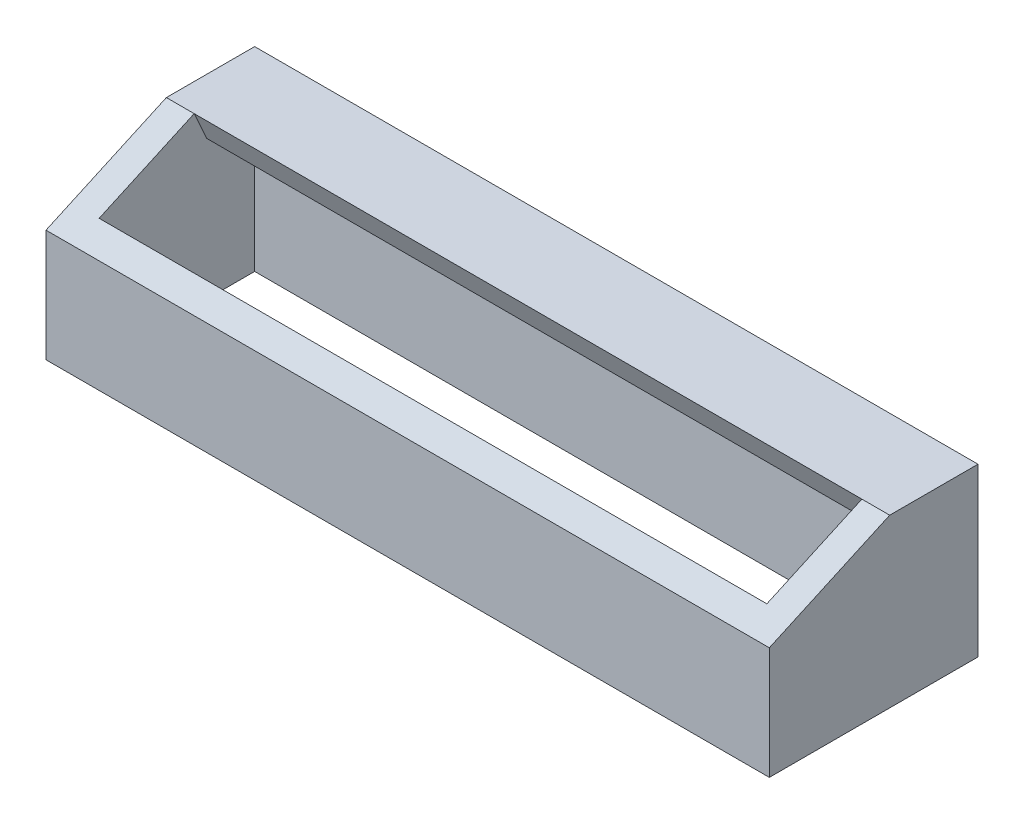
ISO-10303-21;
HEADER;
FILE_DESCRIPTION(('STEP AP214'),'2;1');
FILE_NAME('part.step','',(''),(''),'','','');
FILE_SCHEMA(('AUTOMOTIVE_DESIGN { 1 0 10303 214 1 1 1 1 }'));
ENDSEC;
DATA;
#1=APPLICATION_CONTEXT('core data for automotive mechanical design processes');
#2=APPLICATION_PROTOCOL_DEFINITION('international standard','automotive_design',2000,#1);
#3=PRODUCT_CONTEXT('',#1,'mechanical');
#4=PRODUCT('Part','Part','',(#3));
#5=PRODUCT_RELATED_PRODUCT_CATEGORY('part','',(#4));
#6=PRODUCT_DEFINITION_FORMATION('','',#4);
#7=PRODUCT_DEFINITION_CONTEXT('part definition',#1,'design');
#8=PRODUCT_DEFINITION('design','',#6,#7);
#9=PRODUCT_DEFINITION_SHAPE('','',#8);
#10=(LENGTH_UNIT() NAMED_UNIT(*) SI_UNIT(.MILLI.,.METRE.));
#11=(NAMED_UNIT(*) PLANE_ANGLE_UNIT() SI_UNIT($,.RADIAN.));
#12=(NAMED_UNIT(*) SI_UNIT($,.STERADIAN.) SOLID_ANGLE_UNIT());
#13=UNCERTAINTY_MEASURE_WITH_UNIT(LENGTH_MEASURE(1.E-05),#10,'distance_accuracy_value','');
#14=(GEOMETRIC_REPRESENTATION_CONTEXT(3) GLOBAL_UNCERTAINTY_ASSIGNED_CONTEXT((#13)) GLOBAL_UNIT_ASSIGNED_CONTEXT((#10,
#11,#12)) REPRESENTATION_CONTEXT('',''));
#15=CARTESIAN_POINT('',(0.,0.,0.));
#16=DIRECTION('',(0.,0.,1.));
#17=DIRECTION('',(1.,0.,0.));
#18=AXIS2_PLACEMENT_3D('',#15,#16,#17);
#19=CARTESIAN_POINT('',(0.,100.,0.));
#20=DIRECTION('',(0.,-1.,0.));
#21=DIRECTION('',(0.,0.,-1.));
#22=AXIS2_PLACEMENT_3D('',#19,#20,#21);
#23=PLANE('',#22);
#24=DIRECTION('',(0.,0.,1.));
#25=VECTOR('',#24,1.);
#26=CARTESIAN_POINT('',(240.,100.,-55.));
#27=LINE('',#26,#25);
#28=CARTESIAN_POINT('',(240.,100.,-55.));
#29=VERTEX_POINT('',#28);
#30=CARTESIAN_POINT('',(240.,100.,-20.6070077521786));
#31=VERTEX_POINT('',#30);
#32=EDGE_CURVE('E241',#29,#31,#27,.T.);
#33=ORIENTED_EDGE('',*,*,#32,.T.);
#34=DIRECTION('',(-1.,0.,0.));
#35=VECTOR('',#34,1.);
#36=CARTESIAN_POINT('',(0.,100.,-20.6070077521786));
#37=LINE('',#36,#35);
#38=CARTESIAN_POINT('',(-240.,100.,-20.6070077521786));
#39=VERTEX_POINT('',#38);
#40=EDGE_CURVE('E334',#31,#39,#37,.T.);
#41=ORIENTED_EDGE('',*,*,#40,.T.);
#42=DIRECTION('',(0.,0.,-1.));
#43=VECTOR('',#42,1.);
#44=CARTESIAN_POINT('',(-240.,100.,-55.));
#45=LINE('',#44,#43);
#46=CARTESIAN_POINT('',(-240.,100.,-55.));
#47=VERTEX_POINT('',#46);
#48=EDGE_CURVE('E244',#39,#47,#45,.T.);
#49=ORIENTED_EDGE('',*,*,#48,.T.);
#50=DIRECTION('',(1.,0.,0.));
#51=VECTOR('',#50,1.);
#52=CARTESIAN_POINT('',(240.,100.,-55.));
#53=LINE('',#52,#51);
#54=EDGE_CURVE('E246',#47,#29,#53,.T.);
#55=ORIENTED_EDGE('',*,*,#54,.T.);
#56=EDGE_LOOP('',(#33,#41,#49,#55));
#57=FACE_BOUND('',#56,.T.);
#58=ADVANCED_FACE('F33',(#57),#23,.T.);
#59=CARTESIAN_POINT('',(260.,80.,-75.));
#60=DIRECTION('',(-1.,0.,0.));
#61=DIRECTION('',(0.,0.,1.));
#62=AXIS2_PLACEMENT_3D('',#59,#60,#61);
#63=PLANE('',#62);
#64=DIRECTION('',(0.,0.,-1.));
#65=VECTOR('',#64,1.);
#66=CARTESIAN_POINT('',(260.,120.,-75.));
#67=LINE('',#66,#65);
#68=CARTESIAN_POINT('',(260.,120.,-11.5243954023671));
#69=VERTEX_POINT('',#68);
#70=CARTESIAN_POINT('',(260.,120.,-75.));
#71=VERTEX_POINT('',#70);
#72=EDGE_CURVE('E304',#69,#71,#67,.T.);
#73=ORIENTED_EDGE('',*,*,#72,.F.);
#74=DIRECTION('',(0.,0.413489883926056,-0.910508712693523));
#75=VECTOR('',#74,1.);
#76=CARTESIAN_POINT('',(260.,80.7066228879245,75.));
#77=LINE('',#76,#75);
#78=CARTESIAN_POINT('',(260.,80.7066228879245,75.));
#79=VERTEX_POINT('',#78);
#80=EDGE_CURVE('E283',#79,#69,#77,.T.);
#81=ORIENTED_EDGE('',*,*,#80,.F.);
#82=DIRECTION('',(0.,-1.,0.));
#83=VECTOR('',#82,1.);
#84=CARTESIAN_POINT('',(260.,80.,75.));
#85=LINE('',#84,#83);
#86=CARTESIAN_POINT('',(260.,0.,75.));
#87=VERTEX_POINT('',#86);
#88=EDGE_CURVE('E322',#79,#87,#85,.T.);
#89=ORIENTED_EDGE('',*,*,#88,.T.);
#90=DIRECTION('',(0.,0.,-1.));
#91=VECTOR('',#90,1.);
#92=CARTESIAN_POINT('',(260.,0.,-75.));
#93=LINE('',#92,#91);
#94=CARTESIAN_POINT('',(260.,0.,-75.));
#95=VERTEX_POINT('',#94);
#96=EDGE_CURVE('E309',#87,#95,#93,.T.);
#97=ORIENTED_EDGE('',*,*,#96,.T.);
#98=DIRECTION('',(0.,-1.,0.));
#99=VECTOR('',#98,1.);
#100=CARTESIAN_POINT('',(260.,80.,-75.));
#101=LINE('',#100,#99);
#102=EDGE_CURVE('E329',#71,#95,#101,.T.);
#103=ORIENTED_EDGE('',*,*,#102,.F.);
#104=EDGE_LOOP('',(#73,#81,#89,#97,#103));
#105=FACE_BOUND('',#104,.T.);
#106=ADVANCED_FACE('F35',(#105),#63,.F.);
#107=CARTESIAN_POINT('',(-260.,80.,-75.));
#108=DIRECTION('',(0.,0.,1.));
#109=DIRECTION('',(1.,0.,0.));
#110=AXIS2_PLACEMENT_3D('',#107,#108,#109);
#111=PLANE('',#110);
#112=DIRECTION('',(-1.,0.,0.));
#113=VECTOR('',#112,1.);
#114=CARTESIAN_POINT('',(-260.,0.,-75.));
#115=LINE('',#114,#113);
#116=CARTESIAN_POINT('',(175.,0.,-75.));
#117=VERTEX_POINT('',#116);
#118=CARTESIAN_POINT('',(-175.,0.,-75.));
#119=VERTEX_POINT('',#118);
#120=EDGE_CURVE('E316',#117,#119,#115,.T.);
#121=ORIENTED_EDGE('',*,*,#120,.T.);
#122=DIRECTION('',(0.,1.,0.));
#123=VECTOR('',#122,1.);
#124=CARTESIAN_POINT('',(-175.,80.,-75.));
#125=LINE('',#124,#123);
#126=CARTESIAN_POINT('',(-175.,20.,-75.));
#127=VERTEX_POINT('',#126);
#128=EDGE_CURVE('E47',#119,#127,#125,.T.);
#129=ORIENTED_EDGE('',*,*,#128,.T.);
#130=DIRECTION('',(-1.,0.,0.));
#131=VECTOR('',#130,1.);
#132=CARTESIAN_POINT('',(-260.,20.,-75.));
#133=LINE('',#132,#131);
#134=CARTESIAN_POINT('',(-200.,20.,-75.));
#135=VERTEX_POINT('',#134);
#136=EDGE_CURVE('E11',#127,#135,#133,.T.);
#137=ORIENTED_EDGE('',*,*,#136,.T.);
#138=DIRECTION('',(0.,-1.,0.));
#139=VECTOR('',#138,1.);
#140=CARTESIAN_POINT('',(-200.,80.,-75.));
#141=LINE('',#140,#139);
#142=CARTESIAN_POINT('',(-200.,0.,-75.));
#143=VERTEX_POINT('',#142);
#144=EDGE_CURVE('E202',#135,#143,#141,.T.);
#145=ORIENTED_EDGE('',*,*,#144,.T.);
#146=CARTESIAN_POINT('',(-260.,0.,-75.));
#147=VERTEX_POINT('',#146);
#148=EDGE_CURVE('E312',#143,#147,#115,.T.);
#149=ORIENTED_EDGE('',*,*,#148,.T.);
#150=DIRECTION('',(0.,-1.,0.));
#151=VECTOR('',#150,1.);
#152=CARTESIAN_POINT('',(-260.,80.,-75.));
#153=LINE('',#152,#151);
#154=CARTESIAN_POINT('',(-260.,120.,-75.));
#155=VERTEX_POINT('',#154);
#156=EDGE_CURVE('E326',#155,#147,#153,.T.);
#157=ORIENTED_EDGE('',*,*,#156,.F.);
#158=DIRECTION('',(-1.,0.,0.));
#159=VECTOR('',#158,1.);
#160=CARTESIAN_POINT('',(-260.,120.,-75.));
#161=LINE('',#160,#159);
#162=EDGE_CURVE('E306',#71,#155,#161,.T.);
#163=ORIENTED_EDGE('',*,*,#162,.F.);
#164=ORIENTED_EDGE('',*,*,#102,.T.);
#165=CARTESIAN_POINT('',(200.,0.,-75.));
#166=VERTEX_POINT('',#165);
#167=EDGE_CURVE('E313',#95,#166,#115,.T.);
#168=ORIENTED_EDGE('',*,*,#167,.T.);
#169=DIRECTION('',(0.,1.,0.));
#170=VECTOR('',#169,1.);
#171=CARTESIAN_POINT('',(200.,80.,-75.));
#172=LINE('',#171,#170);
#173=CARTESIAN_POINT('',(200.,20.,-75.));
#174=VERTEX_POINT('',#173);
#175=EDGE_CURVE('E231',#166,#174,#172,.T.);
#176=ORIENTED_EDGE('',*,*,#175,.T.);
#177=DIRECTION('',(-1.,0.,0.));
#178=VECTOR('',#177,1.);
#179=CARTESIAN_POINT('',(-260.,20.,-75.));
#180=LINE('',#179,#178);
#181=CARTESIAN_POINT('',(175.,20.,-75.));
#182=VERTEX_POINT('',#181);
#183=EDGE_CURVE('E41',#174,#182,#180,.T.);
#184=ORIENTED_EDGE('',*,*,#183,.T.);
#185=DIRECTION('',(0.,-1.,0.));
#186=VECTOR('',#185,1.);
#187=CARTESIAN_POINT('',(175.,80.0000000000006,-75.));
#188=LINE('',#187,#186);
#189=EDGE_CURVE('E223',#182,#117,#188,.T.);
#190=ORIENTED_EDGE('',*,*,#189,.T.);
#191=EDGE_LOOP('',(#121,#129,#137,#145,#149,#157,#163,#164,#168,#176,#184,#190));
#192=FACE_BOUND('',#191,.T.);
#193=ADVANCED_FACE('F338',(#192),#111,.F.);
#194=CARTESIAN_POINT('',(-260.,80.,-75.));
#195=DIRECTION('',(1.,0.,0.));
#196=DIRECTION('',(0.,0.,-1.));
#197=AXIS2_PLACEMENT_3D('',#194,#195,#196);
#198=PLANE('',#197);
#199=DIRECTION('',(0.,-1.,0.));
#200=VECTOR('',#199,1.);
#201=CARTESIAN_POINT('',(-260.,80.,75.));
#202=LINE('',#201,#200);
#203=CARTESIAN_POINT('',(-260.,80.7066228879245,75.));
#204=VERTEX_POINT('',#203);
#205=CARTESIAN_POINT('',(-260.,0.,75.));
#206=VERTEX_POINT('',#205);
#207=EDGE_CURVE('E324',#204,#206,#202,.T.);
#208=ORIENTED_EDGE('',*,*,#207,.F.);
#209=DIRECTION('',(0.,0.413489883926056,-0.910508712693523));
#210=VECTOR('',#209,1.);
#211=CARTESIAN_POINT('',(-260.,80.7066228879245,75.));
#212=LINE('',#211,#210);
#213=CARTESIAN_POINT('',(-260.,120.,-11.5243954023671));
#214=VERTEX_POINT('',#213);
#215=EDGE_CURVE('E290',#204,#214,#212,.T.);
#216=ORIENTED_EDGE('',*,*,#215,.T.);
#217=DIRECTION('',(0.,0.,1.));
#218=VECTOR('',#217,1.);
#219=CARTESIAN_POINT('',(-260.,120.,-75.));
#220=LINE('',#219,#218);
#221=EDGE_CURVE('E299',#155,#214,#220,.T.);
#222=ORIENTED_EDGE('',*,*,#221,.F.);
#223=ORIENTED_EDGE('',*,*,#156,.T.);
#224=DIRECTION('',(0.,0.,1.));
#225=VECTOR('',#224,1.);
#226=CARTESIAN_POINT('',(-260.,0.,-75.));
#227=LINE('',#226,#225);
#228=EDGE_CURVE('E315',#147,#206,#227,.T.);
#229=ORIENTED_EDGE('',*,*,#228,.T.);
#230=EDGE_LOOP('',(#208,#216,#222,#223,#229));
#231=FACE_BOUND('',#230,.T.);
#232=ADVANCED_FACE('F359',(#231),#198,.F.);
#233=CARTESIAN_POINT('',(-260.,80.,75.));
#234=DIRECTION('',(0.,0.,-1.));
#235=DIRECTION('',(-1.,0.,0.));
#236=AXIS2_PLACEMENT_3D('',#233,#234,#235);
#237=PLANE('',#236);
#238=ORIENTED_EDGE('',*,*,#88,.F.);
#239=DIRECTION('',(1.,0.,0.));
#240=VECTOR('',#239,1.);
#241=CARTESIAN_POINT('',(-260.,80.7066228879245,75.));
#242=LINE('',#241,#240);
#243=EDGE_CURVE('E293',#204,#79,#242,.T.);
#244=ORIENTED_EDGE('',*,*,#243,.F.);
#245=ORIENTED_EDGE('',*,*,#207,.T.);
#246=DIRECTION('',(1.,0.,0.));
#247=VECTOR('',#246,1.);
#248=CARTESIAN_POINT('',(-260.,0.,75.));
#249=LINE('',#248,#247);
#250=EDGE_CURVE('E319',#206,#87,#249,.T.);
#251=ORIENTED_EDGE('',*,*,#250,.T.);
#252=EDGE_LOOP('',(#238,#244,#245,#251));
#253=FACE_BOUND('',#252,.T.);
#254=ADVANCED_FACE('F364',(#253),#237,.F.);
#255=CARTESIAN_POINT('',(0.,0.,0.));
#256=DIRECTION('',(0.,1.,0.));
#257=DIRECTION('',(0.,0.,1.));
#258=AXIS2_PLACEMENT_3D('',#255,#256,#257);
#259=PLANE('',#258);
#260=ORIENTED_EDGE('',*,*,#148,.F.);
#261=DIRECTION('',(0.,0.,-1.));
#262=VECTOR('',#261,1.);
#263=CARTESIAN_POINT('',(-200.,0.,-65.));
#264=LINE('',#263,#262);
#265=CARTESIAN_POINT('',(-200.,0.,-85.));
#266=VERTEX_POINT('',#265);
#267=EDGE_CURVE('E181',#143,#266,#264,.T.);
#268=ORIENTED_EDGE('',*,*,#267,.T.);
#269=DIRECTION('',(-1.,0.,0.));
#270=VECTOR('',#269,1.);
#271=CARTESIAN_POINT('',(-175.,0.,-85.));
#272=LINE('',#271,#270);
#273=CARTESIAN_POINT('',(-175.,0.,-85.));
#274=VERTEX_POINT('',#273);
#275=EDGE_CURVE('E185',#274,#266,#272,.T.);
#276=ORIENTED_EDGE('',*,*,#275,.F.);
#277=DIRECTION('',(0.,0.,-1.));
#278=VECTOR('',#277,1.);
#279=CARTESIAN_POINT('',(-175.,0.,-65.));
#280=LINE('',#279,#278);
#281=EDGE_CURVE('E173',#119,#274,#280,.T.);
#282=ORIENTED_EDGE('',*,*,#281,.F.);
#283=ORIENTED_EDGE('',*,*,#120,.F.);
#284=DIRECTION('',(0.,0.,-1.));
#285=VECTOR('',#284,1.);
#286=CARTESIAN_POINT('',(175.,0.,-65.));
#287=LINE('',#286,#285);
#288=CARTESIAN_POINT('',(175.,0.,-85.));
#289=VERTEX_POINT('',#288);
#290=EDGE_CURVE('E226',#117,#289,#287,.T.);
#291=ORIENTED_EDGE('',*,*,#290,.T.);
#292=DIRECTION('',(-1.,0.,0.));
#293=VECTOR('',#292,1.);
#294=CARTESIAN_POINT('',(200.,0.,-85.));
#295=LINE('',#294,#293);
#296=CARTESIAN_POINT('',(200.,0.,-85.));
#297=VERTEX_POINT('',#296);
#298=EDGE_CURVE('E211',#297,#289,#295,.T.);
#299=ORIENTED_EDGE('',*,*,#298,.F.);
#300=DIRECTION('',(0.,0.,-1.));
#301=VECTOR('',#300,1.);
#302=CARTESIAN_POINT('',(200.,0.,-65.));
#303=LINE('',#302,#301);
#304=EDGE_CURVE('E220',#166,#297,#303,.T.);
#305=ORIENTED_EDGE('',*,*,#304,.F.);
#306=ORIENTED_EDGE('',*,*,#167,.F.);
#307=ORIENTED_EDGE('',*,*,#96,.F.);
#308=ORIENTED_EDGE('',*,*,#250,.F.);
#309=ORIENTED_EDGE('',*,*,#228,.F.);
#310=EDGE_LOOP('',(#260,#268,#276,#282,#283,#291,#299,#305,#306,#307,#308,#309));
#311=FACE_BOUND('',#310,.T.);
#312=DIRECTION('',(-1.,0.,0.));
#313=VECTOR('',#312,1.);
#314=CARTESIAN_POINT('',(-240.,0.,55.));
#315=LINE('',#314,#313);
#316=CARTESIAN_POINT('',(240.,0.,55.));
#317=VERTEX_POINT('',#316);
#318=CARTESIAN_POINT('',(-240.,0.,55.));
#319=VERTEX_POINT('',#318);
#320=EDGE_CURVE('E273',#317,#319,#315,.T.);
#321=ORIENTED_EDGE('',*,*,#320,.F.);
#322=DIRECTION('',(0.,0.,1.));
#323=VECTOR('',#322,1.);
#324=CARTESIAN_POINT('',(240.,0.,55.));
#325=LINE('',#324,#323);
#326=CARTESIAN_POINT('',(240.,0.,-55.));
#327=VERTEX_POINT('',#326);
#328=EDGE_CURVE('E259',#327,#317,#325,.T.);
#329=ORIENTED_EDGE('',*,*,#328,.F.);
#330=DIRECTION('',(1.,0.,0.));
#331=VECTOR('',#330,1.);
#332=CARTESIAN_POINT('',(-240.,0.,-55.));
#333=LINE('',#332,#331);
#334=CARTESIAN_POINT('',(-240.,0.,-55.));
#335=VERTEX_POINT('',#334);
#336=EDGE_CURVE('E265',#335,#327,#333,.T.);
#337=ORIENTED_EDGE('',*,*,#336,.F.);
#338=DIRECTION('',(0.,0.,-1.));
#339=VECTOR('',#338,1.);
#340=CARTESIAN_POINT('',(-240.,0.,55.));
#341=LINE('',#340,#339);
#342=EDGE_CURVE('E276',#319,#335,#341,.T.);
#343=ORIENTED_EDGE('',*,*,#342,.F.);
#344=EDGE_LOOP('',(#321,#329,#337,#343));
#345=FACE_BOUND('',#344,.T.);
#346=ADVANCED_FACE('F186',(#311,#345),#259,.F.);
#347=CARTESIAN_POINT('',(0.,120.,0.));
#348=DIRECTION('',(0.,1.,0.));
#349=DIRECTION('',(0.,0.,1.));
#350=AXIS2_PLACEMENT_3D('',#347,#348,#349);
#351=PLANE('',#350);
#352=DIRECTION('',(1.,0.,0.));
#353=VECTOR('',#352,1.);
#354=CARTESIAN_POINT('',(-260.,120.,-11.5243954023671));
#355=LINE('',#354,#353);
#356=CARTESIAN_POINT('',(-240.,120.,-11.5243954023671));
#357=VERTEX_POINT('',#356);
#358=EDGE_CURVE('E296',#214,#357,#355,.T.);
#359=ORIENTED_EDGE('',*,*,#358,.T.);
#360=DIRECTION('',(-1.,0.,0.));
#361=VECTOR('',#360,1.);
#362=CARTESIAN_POINT('',(-240.,120.,-11.5243954023671));
#363=LINE('',#362,#361);
#364=CARTESIAN_POINT('',(240.,120.,-11.5243954023671));
#365=VERTEX_POINT('',#364);
#366=EDGE_CURVE('E238',#365,#357,#363,.T.);
#367=ORIENTED_EDGE('',*,*,#366,.F.);
#368=EDGE_CURVE('E300',#365,#69,#355,.T.);
#369=ORIENTED_EDGE('',*,*,#368,.T.);
#370=ORIENTED_EDGE('',*,*,#72,.T.);
#371=ORIENTED_EDGE('',*,*,#162,.T.);
#372=ORIENTED_EDGE('',*,*,#221,.T.);
#373=EDGE_LOOP('',(#359,#367,#369,#370,#371,#372));
#374=FACE_BOUND('',#373,.T.);
#375=ADVANCED_FACE('F368',(#374),#351,.T.);
#376=CARTESIAN_POINT('',(-260.,80.7066228879245,75.));
#377=DIRECTION('',(0.,-0.910508712693523,-0.413489883926056));
#378=DIRECTION('',(0.,0.413489883926056,-0.910508712693523));
#379=AXIS2_PLACEMENT_3D('',#376,#377,#378);
#380=PLANE('',#379);
#381=DIRECTION('',(0.,-0.413489883926056,0.910508712693523));
#382=VECTOR('',#381,1.);
#383=CARTESIAN_POINT('',(-240.,111.730202321479,6.68577885150336));
#384=LINE('',#383,#382);
#385=CARTESIAN_POINT('',(-240.,88.9764205664457,56.7898257461296));
#386=VERTEX_POINT('',#385);
#387=EDGE_CURVE('E249',#357,#386,#384,.T.);
#388=ORIENTED_EDGE('',*,*,#387,.F.);
#389=ORIENTED_EDGE('',*,*,#358,.F.);
#390=ORIENTED_EDGE('',*,*,#215,.F.);
#391=ORIENTED_EDGE('',*,*,#243,.T.);
#392=ORIENTED_EDGE('',*,*,#80,.T.);
#393=ORIENTED_EDGE('',*,*,#368,.F.);
#394=DIRECTION('',(0.,0.413489883926056,-0.910508712693523));
#395=VECTOR('',#394,1.);
#396=CARTESIAN_POINT('',(240.,111.730202321479,6.68577885150336));
#397=LINE('',#396,#395);
#398=CARTESIAN_POINT('',(240.,88.9764205664457,56.7898257461296));
#399=VERTEX_POINT('',#398);
#400=EDGE_CURVE('E254',#399,#365,#397,.T.);
#401=ORIENTED_EDGE('',*,*,#400,.F.);
#402=DIRECTION('',(1.,0.,0.));
#403=VECTOR('',#402,1.);
#404=CARTESIAN_POINT('',(-240.,88.9764205664457,56.7898257461296));
#405=LINE('',#404,#403);
#406=EDGE_CURVE('E251',#386,#399,#405,.T.);
#407=ORIENTED_EDGE('',*,*,#406,.F.);
#408=EDGE_LOOP('',(#388,#389,#390,#391,#392,#393,#401,#407));
#409=FACE_BOUND('',#408,.T.);
#410=ADVANCED_FACE('F375',(#409),#380,.F.);
#411=CARTESIAN_POINT('',(240.,70.,55.));
#412=DIRECTION('',(1.,0.,0.));
#413=DIRECTION('',(0.,0.,-1.));
#414=AXIS2_PLACEMENT_3D('',#411,#412,#413);
#415=PLANE('',#414);
#416=ORIENTED_EDGE('',*,*,#400,.T.);
#417=DIRECTION('',(0.,0.910508712693523,0.413489883926056));
#418=VECTOR('',#417,1.);
#419=CARTESIAN_POINT('',(240.,120.,-11.5243954023671));
#420=LINE('',#419,#418);
#421=EDGE_CURVE('E235',#31,#365,#420,.T.);
#422=ORIENTED_EDGE('',*,*,#421,.F.);
#423=ORIENTED_EDGE('',*,*,#32,.F.);
#424=DIRECTION('',(0.,-1.,0.));
#425=VECTOR('',#424,1.);
#426=CARTESIAN_POINT('',(240.,70.,-55.));
#427=LINE('',#426,#425);
#428=EDGE_CURVE('E281',#29,#327,#427,.T.);
#429=ORIENTED_EDGE('',*,*,#428,.T.);
#430=ORIENTED_EDGE('',*,*,#328,.T.);
#431=DIRECTION('',(0.,-1.,0.));
#432=VECTOR('',#431,1.);
#433=CARTESIAN_POINT('',(240.,70.,55.));
#434=LINE('',#433,#432);
#435=CARTESIAN_POINT('',(240.,70.,55.));
#436=VERTEX_POINT('',#435);
#437=EDGE_CURVE('E271',#436,#317,#434,.T.);
#438=ORIENTED_EDGE('',*,*,#437,.F.);
#439=DIRECTION('',(0.,0.,1.));
#440=VECTOR('',#439,1.);
#441=CARTESIAN_POINT('',(240.,70.,55.));
#442=LINE('',#441,#440);
#443=CARTESIAN_POINT('',(240.,70.,48.1720521565288));
#444=VERTEX_POINT('',#443);
#445=EDGE_CURVE('E262',#444,#436,#442,.T.);
#446=ORIENTED_EDGE('',*,*,#445,.F.);
#447=DIRECTION('',(0.,0.910508712693523,0.413489883926056));
#448=VECTOR('',#447,1.);
#449=CARTESIAN_POINT('',(240.,25.240810677899,27.8455338713056));
#450=LINE('',#449,#448);
#451=EDGE_CURVE('E257',#444,#399,#450,.T.);
#452=ORIENTED_EDGE('',*,*,#451,.T.);
#453=EDGE_LOOP('',(#416,#422,#423,#429,#430,#438,#446,#452));
#454=FACE_BOUND('',#453,.T.);
#455=ADVANCED_FACE('F384',(#454),#415,.F.);
#456=CARTESIAN_POINT('',(-240.,70.,-55.));
#457=DIRECTION('',(0.,0.,-1.));
#458=DIRECTION('',(-1.,0.,0.));
#459=AXIS2_PLACEMENT_3D('',#456,#457,#458);
#460=PLANE('',#459);
#461=ORIENTED_EDGE('',*,*,#336,.T.);
#462=ORIENTED_EDGE('',*,*,#428,.F.);
#463=ORIENTED_EDGE('',*,*,#54,.F.);
#464=DIRECTION('',(0.,-1.,0.));
#465=VECTOR('',#464,1.);
#466=CARTESIAN_POINT('',(-240.,70.,-55.));
#467=LINE('',#466,#465);
#468=EDGE_CURVE('E284',#47,#335,#467,.T.);
#469=ORIENTED_EDGE('',*,*,#468,.T.);
#470=EDGE_LOOP('',(#461,#462,#463,#469));
#471=FACE_BOUND('',#470,.T.);
#472=ADVANCED_FACE('F390',(#471),#460,.F.);
#473=CARTESIAN_POINT('',(-240.,70.,55.));
#474=DIRECTION('',(-1.,0.,0.));
#475=DIRECTION('',(0.,0.,1.));
#476=AXIS2_PLACEMENT_3D('',#473,#474,#475);
#477=PLANE('',#476);
#478=ORIENTED_EDGE('',*,*,#48,.F.);
#479=DIRECTION('',(0.,-0.910508712693523,-0.413489883926056));
#480=VECTOR('',#479,1.);
#481=CARTESIAN_POINT('',(-240.,120.,-11.5243954023671));
#482=LINE('',#481,#480);
#483=EDGE_CURVE('E233',#357,#39,#482,.T.);
#484=ORIENTED_EDGE('',*,*,#483,.F.);
#485=ORIENTED_EDGE('',*,*,#387,.T.);
#486=DIRECTION('',(0.,0.910508712693523,0.413489883926056));
#487=VECTOR('',#486,1.);
#488=CARTESIAN_POINT('',(-240.,25.240810677899,27.8455338713056));
#489=LINE('',#488,#487);
#490=CARTESIAN_POINT('',(-240.,70.,48.1720521565288));
#491=VERTEX_POINT('',#490);
#492=EDGE_CURVE('E256',#491,#386,#489,.T.);
#493=ORIENTED_EDGE('',*,*,#492,.F.);
#494=DIRECTION('',(0.,0.,-1.));
#495=VECTOR('',#494,1.);
#496=CARTESIAN_POINT('',(-240.,70.,55.));
#497=LINE('',#496,#495);
#498=CARTESIAN_POINT('',(-240.,70.,55.));
#499=VERTEX_POINT('',#498);
#500=EDGE_CURVE('E268',#499,#491,#497,.T.);
#501=ORIENTED_EDGE('',*,*,#500,.F.);
#502=DIRECTION('',(0.,-1.,0.));
#503=VECTOR('',#502,1.);
#504=CARTESIAN_POINT('',(-240.,70.,55.));
#505=LINE('',#504,#503);
#506=EDGE_CURVE('E286',#499,#319,#505,.T.);
#507=ORIENTED_EDGE('',*,*,#506,.T.);
#508=ORIENTED_EDGE('',*,*,#342,.T.);
#509=ORIENTED_EDGE('',*,*,#468,.F.);
#510=EDGE_LOOP('',(#478,#484,#485,#493,#501,#507,#508,#509));
#511=FACE_BOUND('',#510,.T.);
#512=ADVANCED_FACE('F401',(#511),#477,.F.);
#513=CARTESIAN_POINT('',(-240.,70.,55.));
#514=DIRECTION('',(0.,0.,1.));
#515=DIRECTION('',(1.,0.,0.));
#516=AXIS2_PLACEMENT_3D('',#513,#514,#515);
#517=PLANE('',#516);
#518=ORIENTED_EDGE('',*,*,#320,.T.);
#519=ORIENTED_EDGE('',*,*,#506,.F.);
#520=DIRECTION('',(-1.,0.,0.));
#521=VECTOR('',#520,1.);
#522=CARTESIAN_POINT('',(-240.,70.,55.));
#523=LINE('',#522,#521);
#524=EDGE_CURVE('E264',#436,#499,#523,.T.);
#525=ORIENTED_EDGE('',*,*,#524,.F.);
#526=ORIENTED_EDGE('',*,*,#437,.T.);
#527=EDGE_LOOP('',(#518,#519,#525,#526));
#528=FACE_BOUND('',#527,.T.);
#529=ADVANCED_FACE('F398',(#528),#517,.F.);
#530=CARTESIAN_POINT('',(0.,70.,0.));
#531=DIRECTION('',(0.,-1.,0.));
#532=DIRECTION('',(0.,0.,-1.));
#533=AXIS2_PLACEMENT_3D('',#530,#531,#532);
#534=PLANE('',#533);
#535=DIRECTION('',(-1.,0.,0.));
#536=VECTOR('',#535,1.);
#537=CARTESIAN_POINT('',(0.,70.,48.1720521565288));
#538=LINE('',#537,#536);
#539=EDGE_CURVE('E332',#444,#491,#538,.T.);
#540=ORIENTED_EDGE('',*,*,#539,.F.);
#541=ORIENTED_EDGE('',*,*,#445,.T.);
#542=ORIENTED_EDGE('',*,*,#524,.T.);
#543=ORIENTED_EDGE('',*,*,#500,.T.);
#544=EDGE_LOOP('',(#540,#541,#542,#543));
#545=FACE_BOUND('',#544,.T.);
#546=ADVANCED_FACE('F406',(#545),#534,.T.);
#547=CARTESIAN_POINT('',(-240.,25.240810677899,27.8455338713056));
#548=DIRECTION('',(0.,-0.413489883926056,0.910508712693523));
#549=DIRECTION('',(0.,-0.910508712693523,-0.413489883926056));
#550=AXIS2_PLACEMENT_3D('',#547,#548,#549);
#551=PLANE('',#550);
#552=ORIENTED_EDGE('',*,*,#539,.T.);
#553=ORIENTED_EDGE('',*,*,#492,.T.);
#554=ORIENTED_EDGE('',*,*,#406,.T.);
#555=ORIENTED_EDGE('',*,*,#451,.F.);
#556=EDGE_LOOP('',(#552,#553,#554,#555));
#557=FACE_BOUND('',#556,.T.);
#558=ADVANCED_FACE('F408',(#557),#551,.F.);
#559=CARTESIAN_POINT('',(0.,24.855641256161,-54.7323617894513));
#560=DIRECTION('',(0.,-0.413489883926056,0.910508712693523));
#561=DIRECTION('',(0.,-0.910508712693523,-0.413489883926056));
#562=AXIS2_PLACEMENT_3D('',#559,#560,#561);
#563=PLANE('',#562);
#564=ORIENTED_EDGE('',*,*,#421,.T.);
#565=ORIENTED_EDGE('',*,*,#366,.T.);
#566=ORIENTED_EDGE('',*,*,#483,.T.);
#567=ORIENTED_EDGE('',*,*,#40,.F.);
#568=EDGE_LOOP('',(#564,#565,#566,#567));
#569=FACE_BOUND('',#568,.T.);
#570=ADVANCED_FACE('F379',(#569),#563,.T.);
#571=CARTESIAN_POINT('',(200.,20.,-65.));
#572=DIRECTION('',(0.,1.,0.));
#573=DIRECTION('',(0.,0.,1.));
#574=AXIS2_PLACEMENT_3D('',#571,#572,#573);
#575=PLANE('',#574);
#576=ORIENTED_EDGE('',*,*,#183,.F.);
#577=DIRECTION('',(0.,0.,-1.));
#578=VECTOR('',#577,1.);
#579=CARTESIAN_POINT('',(200.,20.,-65.));
#580=LINE('',#579,#578);
#581=CARTESIAN_POINT('',(200.,20.,-85.));
#582=VERTEX_POINT('',#581);
#583=EDGE_CURVE('E221',#174,#582,#580,.T.);
#584=ORIENTED_EDGE('',*,*,#583,.T.);
#585=DIRECTION('',(1.,0.,0.));
#586=VECTOR('',#585,1.);
#587=CARTESIAN_POINT('',(200.,20.,-85.));
#588=LINE('',#587,#586);
#589=CARTESIAN_POINT('',(175.,20.,-85.));
#590=VERTEX_POINT('',#589);
#591=EDGE_CURVE('E217',#590,#582,#588,.T.);
#592=ORIENTED_EDGE('',*,*,#591,.F.);
#593=DIRECTION('',(0.,0.,-1.));
#594=VECTOR('',#593,1.);
#595=CARTESIAN_POINT('',(175.,20.,-65.));
#596=LINE('',#595,#594);
#597=EDGE_CURVE('E224',#182,#590,#596,.T.);
#598=ORIENTED_EDGE('',*,*,#597,.F.);
#599=EDGE_LOOP('',(#576,#584,#592,#598));
#600=FACE_BOUND('',#599,.T.);
#601=ADVANCED_FACE('F348',(#600),#575,.T.);
#602=CARTESIAN_POINT('',(200.,20.,-65.));
#603=DIRECTION('',(1.,0.,0.));
#604=DIRECTION('',(0.,0.,-1.));
#605=AXIS2_PLACEMENT_3D('',#602,#603,#604);
#606=PLANE('',#605);
#607=ORIENTED_EDGE('',*,*,#175,.F.);
#608=ORIENTED_EDGE('',*,*,#304,.T.);
#609=DIRECTION('',(0.,-1.,0.));
#610=VECTOR('',#609,1.);
#611=CARTESIAN_POINT('',(200.,20.,-85.));
#612=LINE('',#611,#610);
#613=EDGE_CURVE('E208',#582,#297,#612,.T.);
#614=ORIENTED_EDGE('',*,*,#613,.F.);
#615=ORIENTED_EDGE('',*,*,#583,.F.);
#616=EDGE_LOOP('',(#607,#608,#614,#615));
#617=FACE_BOUND('',#616,.T.);
#618=ADVANCED_FACE('F423',(#617),#606,.T.);
#619=CARTESIAN_POINT('',(175.,20.,-65.));
#620=DIRECTION('',(-1.,0.,0.));
#621=DIRECTION('',(0.,-1.,0.));
#622=AXIS2_PLACEMENT_3D('',#619,#620,#621);
#623=PLANE('',#622);
#624=ORIENTED_EDGE('',*,*,#189,.F.);
#625=ORIENTED_EDGE('',*,*,#597,.T.);
#626=DIRECTION('',(0.,1.,0.));
#627=VECTOR('',#626,1.);
#628=CARTESIAN_POINT('',(175.,20.,-85.));
#629=LINE('',#628,#627);
#630=EDGE_CURVE('E214',#289,#590,#629,.T.);
#631=ORIENTED_EDGE('',*,*,#630,.F.);
#632=ORIENTED_EDGE('',*,*,#290,.F.);
#633=EDGE_LOOP('',(#624,#625,#631,#632));
#634=FACE_BOUND('',#633,.T.);
#635=ADVANCED_FACE('F345',(#634),#623,.T.);
#636=CARTESIAN_POINT('',(0.,0.,-85.));
#637=DIRECTION('',(0.,0.,-1.));
#638=DIRECTION('',(-1.,0.,0.));
#639=AXIS2_PLACEMENT_3D('',#636,#637,#638);
#640=PLANE('',#639);
#641=ORIENTED_EDGE('',*,*,#613,.T.);
#642=ORIENTED_EDGE('',*,*,#298,.T.);
#643=ORIENTED_EDGE('',*,*,#630,.T.);
#644=ORIENTED_EDGE('',*,*,#591,.T.);
#645=EDGE_LOOP('',(#641,#642,#643,#644));
#646=FACE_BOUND('',#645,.T.);
#647=ADVANCED_FACE('F351',(#646),#640,.T.);
#648=CARTESIAN_POINT('',(-175.,20.,-65.));
#649=DIRECTION('',(0.,1.,0.));
#650=DIRECTION('',(-1.,0.,0.));
#651=AXIS2_PLACEMENT_3D('',#648,#649,#650);
#652=PLANE('',#651);
#653=ORIENTED_EDGE('',*,*,#136,.F.);
#654=DIRECTION('',(0.,0.,-1.));
#655=VECTOR('',#654,1.);
#656=CARTESIAN_POINT('',(-175.,20.,-65.));
#657=LINE('',#656,#655);
#658=CARTESIAN_POINT('',(-175.,20.,-85.));
#659=VERTEX_POINT('',#658);
#660=EDGE_CURVE('E200',#127,#659,#657,.T.);
#661=ORIENTED_EDGE('',*,*,#660,.T.);
#662=DIRECTION('',(1.,0.,0.));
#663=VECTOR('',#662,1.);
#664=CARTESIAN_POINT('',(-175.,20.,-85.));
#665=LINE('',#664,#663);
#666=CARTESIAN_POINT('',(-200.,20.,-85.));
#667=VERTEX_POINT('',#666);
#668=EDGE_CURVE('E182',#667,#659,#665,.T.);
#669=ORIENTED_EDGE('',*,*,#668,.F.);
#670=DIRECTION('',(0.,0.,-1.));
#671=VECTOR('',#670,1.);
#672=CARTESIAN_POINT('',(-200.,20.,-65.));
#673=LINE('',#672,#671);
#674=EDGE_CURVE('E203',#135,#667,#673,.T.);
#675=ORIENTED_EDGE('',*,*,#674,.F.);
#676=EDGE_LOOP('',(#653,#661,#669,#675));
#677=FACE_BOUND('',#676,.T.);
#678=ADVANCED_FACE('F433',(#677),#652,.T.);
#679=CARTESIAN_POINT('',(-175.,20.,-65.));
#680=DIRECTION('',(1.,0.,0.));
#681=DIRECTION('',(0.,0.,-1.));
#682=AXIS2_PLACEMENT_3D('',#679,#680,#681);
#683=PLANE('',#682);
#684=ORIENTED_EDGE('',*,*,#128,.F.);
#685=ORIENTED_EDGE('',*,*,#281,.T.);
#686=DIRECTION('',(0.,-1.,0.));
#687=VECTOR('',#686,1.);
#688=CARTESIAN_POINT('',(-175.,20.,-85.));
#689=LINE('',#688,#687);
#690=EDGE_CURVE('E178',#659,#274,#689,.T.);
#691=ORIENTED_EDGE('',*,*,#690,.F.);
#692=ORIENTED_EDGE('',*,*,#660,.F.);
#693=EDGE_LOOP('',(#684,#685,#691,#692));
#694=FACE_BOUND('',#693,.T.);
#695=ADVANCED_FACE('F175',(#694),#683,.T.);
#696=CARTESIAN_POINT('',(-200.,20.,-65.));
#697=DIRECTION('',(-1.,0.,0.));
#698=DIRECTION('',(0.,0.,1.));
#699=AXIS2_PLACEMENT_3D('',#696,#697,#698);
#700=PLANE('',#699);
#701=ORIENTED_EDGE('',*,*,#144,.F.);
#702=ORIENTED_EDGE('',*,*,#674,.T.);
#703=DIRECTION('',(0.,1.,0.));
#704=VECTOR('',#703,1.);
#705=CARTESIAN_POINT('',(-200.,20.,-85.));
#706=LINE('',#705,#704);
#707=EDGE_CURVE('E192',#266,#667,#706,.T.);
#708=ORIENTED_EDGE('',*,*,#707,.F.);
#709=ORIENTED_EDGE('',*,*,#267,.F.);
#710=EDGE_LOOP('',(#701,#702,#708,#709));
#711=FACE_BOUND('',#710,.T.);
#712=ADVANCED_FACE('F436',(#711),#700,.T.);
#713=CARTESIAN_POINT('',(0.,0.,-85.));
#714=DIRECTION('',(0.,0.,-1.));
#715=DIRECTION('',(-1.,0.,0.));
#716=AXIS2_PLACEMENT_3D('',#713,#714,#715);
#717=PLANE('',#716);
#718=ORIENTED_EDGE('',*,*,#690,.T.);
#719=ORIENTED_EDGE('',*,*,#275,.T.);
#720=ORIENTED_EDGE('',*,*,#707,.T.);
#721=ORIENTED_EDGE('',*,*,#668,.T.);
#722=EDGE_LOOP('',(#718,#719,#720,#721));
#723=FACE_BOUND('',#722,.T.);
#724=ADVANCED_FACE('F194',(#723),#717,.T.);
#725=CLOSED_SHELL('',(#58,#106,#193,#232,#254,#346,#375,#410,#455,#472,#512,#529,#546,#558,#570,
#601,#618,#635,#647,#678,#695,#712,#724));
#726=MANIFOLD_SOLID_BREP('B2',#725);
#727=ADVANCED_BREP_SHAPE_REPRESENTATION('',(#18,#726),#14);
#728=SHAPE_DEFINITION_REPRESENTATION(#9,#727);
ENDSEC;
END-ISO-10303-21;
